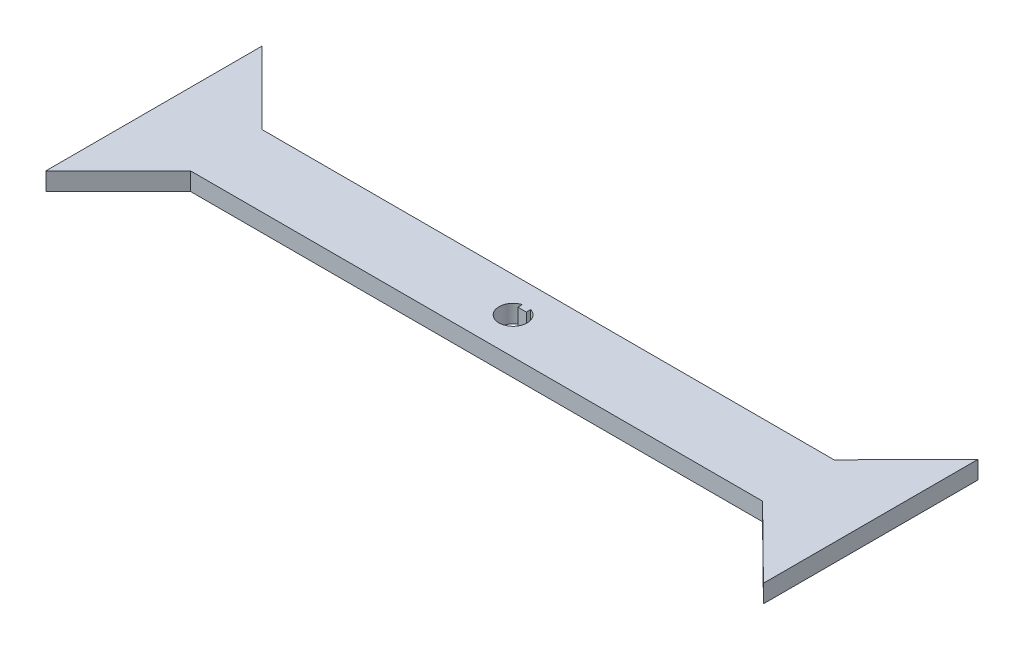
ISO-10303-21;
HEADER;
FILE_DESCRIPTION(('STEP AP214'),'2;1');
FILE_NAME('part.step','',(''),(''),'','','');
FILE_SCHEMA(('AUTOMOTIVE_DESIGN { 1 0 10303 214 1 1 1 1 }'));
ENDSEC;
DATA;
#1=APPLICATION_CONTEXT('core data for automotive mechanical design processes');
#2=APPLICATION_PROTOCOL_DEFINITION('international standard','automotive_design',2000,#1);
#3=PRODUCT_CONTEXT('',#1,'mechanical');
#4=PRODUCT('Part','Part','',(#3));
#5=PRODUCT_RELATED_PRODUCT_CATEGORY('part','',(#4));
#6=PRODUCT_DEFINITION_FORMATION('','',#4);
#7=PRODUCT_DEFINITION_CONTEXT('part definition',#1,'design');
#8=PRODUCT_DEFINITION('design','',#6,#7);
#9=PRODUCT_DEFINITION_SHAPE('','',#8);
#10=(LENGTH_UNIT() NAMED_UNIT(*) SI_UNIT(.MILLI.,.METRE.));
#11=(NAMED_UNIT(*) PLANE_ANGLE_UNIT() SI_UNIT($,.RADIAN.));
#12=(NAMED_UNIT(*) SI_UNIT($,.STERADIAN.) SOLID_ANGLE_UNIT());
#13=UNCERTAINTY_MEASURE_WITH_UNIT(LENGTH_MEASURE(1.E-05),#10,'distance_accuracy_value','');
#14=(GEOMETRIC_REPRESENTATION_CONTEXT(3) GLOBAL_UNCERTAINTY_ASSIGNED_CONTEXT((#13)) GLOBAL_UNIT_ASSIGNED_CONTEXT((#10,
#11,#12)) REPRESENTATION_CONTEXT('',''));
#15=CARTESIAN_POINT('',(0.,0.,0.));
#16=DIRECTION('',(0.,0.,1.));
#17=DIRECTION('',(1.,0.,0.));
#18=AXIS2_PLACEMENT_3D('',#15,#16,#17);
#19=CARTESIAN_POINT('',(0.,6.35,-25.4));
#20=DIRECTION('',(0.,0.,-1.));
#21=DIRECTION('',(-1.,0.,0.));
#22=AXIS2_PLACEMENT_3D('',#19,#20,#21);
#23=PLANE('',#22);
#24=DIRECTION('',(1.,0.,0.));
#25=VECTOR('',#24,1.);
#26=CARTESIAN_POINT('',(0.,0.,-25.4));
#27=LINE('',#26,#25);
#28=CARTESIAN_POINT('',(25.6292917522596,0.,-25.4));
#29=VERTEX_POINT('',#28);
#30=CARTESIAN_POINT('',(228.829291752258,0.,-25.4));
#31=VERTEX_POINT('',#30);
#32=EDGE_CURVE('E192',#29,#31,#27,.T.);
#33=ORIENTED_EDGE('',*,*,#32,.F.);
#34=DIRECTION('',(0.,-1.,0.));
#35=VECTOR('',#34,1.);
#36=CARTESIAN_POINT('',(25.6292917522596,6.35,-25.4));
#37=LINE('',#36,#35);
#38=CARTESIAN_POINT('',(25.6292917522596,6.35,-25.4));
#39=VERTEX_POINT('',#38);
#40=EDGE_CURVE('E11',#39,#29,#37,.T.);
#41=ORIENTED_EDGE('',*,*,#40,.F.);
#42=DIRECTION('',(1.,0.,0.));
#43=VECTOR('',#42,1.);
#44=CARTESIAN_POINT('',(0.,6.35,-25.4));
#45=LINE('',#44,#43);
#46=CARTESIAN_POINT('',(228.829291752258,6.35,-25.4));
#47=VERTEX_POINT('',#46);
#48=EDGE_CURVE('E266',#39,#47,#45,.T.);
#49=ORIENTED_EDGE('',*,*,#48,.T.);
#50=DIRECTION('',(0.,-1.,0.));
#51=VECTOR('',#50,1.);
#52=CARTESIAN_POINT('',(228.829291752258,6.35,-25.4));
#53=LINE('',#52,#51);
#54=EDGE_CURVE('E111',#47,#31,#53,.T.);
#55=ORIENTED_EDGE('',*,*,#54,.T.);
#56=EDGE_LOOP('',(#33,#41,#49,#55));
#57=FACE_BOUND('',#56,.T.);
#58=ADVANCED_FACE('F45',(#57),#23,.T.);
#59=CARTESIAN_POINT('',(25.5146458761298,6.35,-25.5146458761298));
#60=DIRECTION('',(0.707106781186548,0.,-0.707106781186548));
#61=DIRECTION('',(-0.707106781186548,0.,-0.707106781186548));
#62=AXIS2_PLACEMENT_3D('',#59,#60,#61);
#63=PLANE('',#62);
#64=DIRECTION('',(0.707106781186548,0.,0.707106781186548));
#65=VECTOR('',#64,1.);
#66=CARTESIAN_POINT('',(25.5146458761298,0.,-25.5146458761298));
#67=LINE('',#66,#65);
#68=CARTESIAN_POINT('',(0.,0.,-51.0292917522596));
#69=VERTEX_POINT('',#68);
#70=EDGE_CURVE('E196',#69,#29,#67,.T.);
#71=ORIENTED_EDGE('',*,*,#70,.F.);
#72=DIRECTION('',(0.,-1.,0.));
#73=VECTOR('',#72,1.);
#74=CARTESIAN_POINT('',(0.,6.35,-51.0292917522596));
#75=LINE('',#74,#73);
#76=CARTESIAN_POINT('',(0.,6.35,-51.0292917522596));
#77=VERTEX_POINT('',#76);
#78=EDGE_CURVE('E56',#77,#69,#75,.T.);
#79=ORIENTED_EDGE('',*,*,#78,.F.);
#80=DIRECTION('',(0.707106781186548,0.,0.707106781186548));
#81=VECTOR('',#80,1.);
#82=CARTESIAN_POINT('',(25.5146458761298,6.35,-25.5146458761298));
#83=LINE('',#82,#81);
#84=EDGE_CURVE('E269',#77,#39,#83,.T.);
#85=ORIENTED_EDGE('',*,*,#84,.T.);
#86=ORIENTED_EDGE('',*,*,#40,.T.);
#87=EDGE_LOOP('',(#71,#79,#85,#86));
#88=FACE_BOUND('',#87,.T.);
#89=ADVANCED_FACE('F295',(#88),#63,.T.);
#90=CARTESIAN_POINT('',(0.,6.35,0.));
#91=DIRECTION('',(-1.,0.,0.));
#92=DIRECTION('',(0.,0.,1.));
#93=AXIS2_PLACEMENT_3D('',#90,#91,#92);
#94=PLANE('',#93);
#95=DIRECTION('',(0.,0.,-1.));
#96=VECTOR('',#95,1.);
#97=CARTESIAN_POINT('',(0.,0.,0.));
#98=LINE('',#97,#96);
#99=CARTESIAN_POINT('',(0.,0.,25.6292917522597));
#100=VERTEX_POINT('',#99);
#101=EDGE_CURVE('E200',#100,#69,#98,.T.);
#102=ORIENTED_EDGE('',*,*,#101,.F.);
#103=DIRECTION('',(0.,-1.,0.));
#104=VECTOR('',#103,1.);
#105=CARTESIAN_POINT('',(0.,6.35,25.6292917522597));
#106=LINE('',#105,#104);
#107=CARTESIAN_POINT('',(0.,6.35,25.6292917522597));
#108=VERTEX_POINT('',#107);
#109=EDGE_CURVE('E230',#108,#100,#106,.T.);
#110=ORIENTED_EDGE('',*,*,#109,.F.);
#111=DIRECTION('',(0.,0.,-1.));
#112=VECTOR('',#111,1.);
#113=CARTESIAN_POINT('',(0.,6.35,0.));
#114=LINE('',#113,#112);
#115=EDGE_CURVE('E276',#108,#77,#114,.T.);
#116=ORIENTED_EDGE('',*,*,#115,.T.);
#117=ORIENTED_EDGE('',*,*,#78,.T.);
#118=EDGE_LOOP('',(#102,#110,#116,#117));
#119=FACE_BOUND('',#118,.T.);
#120=ADVANCED_FACE('F298',(#119),#94,.T.);
#121=CARTESIAN_POINT('',(12.8146458761298,6.35,12.8146458761298));
#122=DIRECTION('',(-0.707106781186548,0.,-0.707106781186547));
#123=DIRECTION('',(-0.707106781186547,0.,0.707106781186548));
#124=AXIS2_PLACEMENT_3D('',#121,#122,#123);
#125=PLANE('',#124);
#126=DIRECTION('',(0.707106781186547,0.,-0.707106781186548));
#127=VECTOR('',#126,1.);
#128=CARTESIAN_POINT('',(12.8146458761298,0.,12.8146458761298));
#129=LINE('',#128,#127);
#130=CARTESIAN_POINT('',(25.6292917522596,0.,0.));
#131=VERTEX_POINT('',#130);
#132=EDGE_CURVE('E204',#100,#131,#129,.T.);
#133=ORIENTED_EDGE('',*,*,#132,.T.);
#134=DIRECTION('',(0.,-1.,0.));
#135=VECTOR('',#134,1.);
#136=CARTESIAN_POINT('',(25.6292917522596,6.35,0.));
#137=LINE('',#136,#135);
#138=CARTESIAN_POINT('',(25.6292917522596,6.35,0.));
#139=VERTEX_POINT('',#138);
#140=EDGE_CURVE('E226',#139,#131,#137,.T.);
#141=ORIENTED_EDGE('',*,*,#140,.F.);
#142=DIRECTION('',(0.707106781186547,0.,-0.707106781186548));
#143=VECTOR('',#142,1.);
#144=CARTESIAN_POINT('',(12.8146458761298,6.35,12.8146458761298));
#145=LINE('',#144,#143);
#146=EDGE_CURVE('E280',#108,#139,#145,.T.);
#147=ORIENTED_EDGE('',*,*,#146,.F.);
#148=ORIENTED_EDGE('',*,*,#109,.T.);
#149=EDGE_LOOP('',(#133,#141,#147,#148));
#150=FACE_BOUND('',#149,.T.);
#151=ADVANCED_FACE('F288',(#150),#125,.F.);
#152=CARTESIAN_POINT('',(0.,6.35,0.));
#153=DIRECTION('',(0.,0.,-1.));
#154=DIRECTION('',(-1.,0.,0.));
#155=AXIS2_PLACEMENT_3D('',#152,#153,#154);
#156=PLANE('',#155);
#157=DIRECTION('',(1.,0.,0.));
#158=VECTOR('',#157,1.);
#159=CARTESIAN_POINT('',(0.,0.,0.));
#160=LINE('',#159,#158);
#161=CARTESIAN_POINT('',(228.829291752258,0.,0.));
#162=VERTEX_POINT('',#161);
#163=EDGE_CURVE('E208',#131,#162,#160,.T.);
#164=ORIENTED_EDGE('',*,*,#163,.T.);
#165=DIRECTION('',(0.,-1.,0.));
#166=VECTOR('',#165,1.);
#167=CARTESIAN_POINT('',(228.829291752258,6.35,0.));
#168=LINE('',#167,#166);
#169=CARTESIAN_POINT('',(228.829291752258,6.35,0.));
#170=VERTEX_POINT('',#169);
#171=EDGE_CURVE('E159',#170,#162,#168,.T.);
#172=ORIENTED_EDGE('',*,*,#171,.F.);
#173=DIRECTION('',(1.,0.,0.));
#174=VECTOR('',#173,1.);
#175=CARTESIAN_POINT('',(0.,6.35,0.));
#176=LINE('',#175,#174);
#177=EDGE_CURVE('E164',#139,#170,#176,.T.);
#178=ORIENTED_EDGE('',*,*,#177,.F.);
#179=ORIENTED_EDGE('',*,*,#140,.T.);
#180=EDGE_LOOP('',(#164,#172,#178,#179));
#181=FACE_BOUND('',#180,.T.);
#182=ADVANCED_FACE('F291',(#181),#156,.F.);
#183=CARTESIAN_POINT('',(113.031199415503,6.35,-114.406281588253));
#184=DIRECTION('',(-0.702818783375139,0.,0.711368932225107));
#185=DIRECTION('',(0.711368932225107,0.,0.702818783375139));
#186=AXIS2_PLACEMENT_3D('',#183,#184,#185);
#187=PLANE('',#186);
#188=DIRECTION('',(-0.711368932225107,0.,-0.702818783375139));
#189=VECTOR('',#188,1.);
#190=CARTESIAN_POINT('',(113.031199415503,0.,-114.406281588253));
#191=LINE('',#190,#189);
#192=CARTESIAN_POINT('',(254.229291752264,0.,25.0947100569799));
#193=VERTEX_POINT('',#192);
#194=EDGE_CURVE('E153',#193,#162,#191,.T.);
#195=ORIENTED_EDGE('',*,*,#194,.F.);
#196=DIRECTION('',(0.,-1.,0.));
#197=VECTOR('',#196,1.);
#198=CARTESIAN_POINT('',(254.229291752264,6.35,25.0947100569799));
#199=LINE('',#198,#197);
#200=CARTESIAN_POINT('',(254.229291752264,6.35,25.0947100569799));
#201=VERTEX_POINT('',#200);
#202=EDGE_CURVE('E148',#201,#193,#199,.T.);
#203=ORIENTED_EDGE('',*,*,#202,.F.);
#204=DIRECTION('',(-0.711368932225107,0.,-0.702818783375139));
#205=VECTOR('',#204,1.);
#206=CARTESIAN_POINT('',(113.031199415503,6.35,-114.406281588253));
#207=LINE('',#206,#205);
#208=EDGE_CURVE('E151',#201,#170,#207,.T.);
#209=ORIENTED_EDGE('',*,*,#208,.T.);
#210=ORIENTED_EDGE('',*,*,#171,.T.);
#211=EDGE_LOOP('',(#195,#203,#209,#210));
#212=FACE_BOUND('',#211,.T.);
#213=ADVANCED_FACE('F150',(#212),#187,.T.);
#214=CARTESIAN_POINT('',(254.229291752264,6.35,-5.5561262448329E-13));
#215=DIRECTION('',(1.,0.,0.));
#216=DIRECTION('',(0.,0.,-1.));
#217=AXIS2_PLACEMENT_3D('',#214,#215,#216);
#218=PLANE('',#217);
#219=DIRECTION('',(0.,0.,1.));
#220=VECTOR('',#219,1.);
#221=CARTESIAN_POINT('',(254.229291752264,0.,-5.5561262448329E-13));
#222=LINE('',#221,#220);
#223=CARTESIAN_POINT('',(254.229291752264,0.,-51.1052899430199));
#224=VERTEX_POINT('',#223);
#225=EDGE_CURVE('E214',#224,#193,#222,.T.);
#226=ORIENTED_EDGE('',*,*,#225,.F.);
#227=DIRECTION('',(0.,-1.,0.));
#228=VECTOR('',#227,1.);
#229=CARTESIAN_POINT('',(254.229291752264,6.35,-51.1052899430199));
#230=LINE('',#229,#228);
#231=CARTESIAN_POINT('',(254.229291752264,6.35,-51.1052899430199));
#232=VERTEX_POINT('',#231);
#233=EDGE_CURVE('E104',#232,#224,#230,.T.);
#234=ORIENTED_EDGE('',*,*,#233,.F.);
#235=DIRECTION('',(0.,0.,1.));
#236=VECTOR('',#235,1.);
#237=CARTESIAN_POINT('',(254.229291752264,6.35,-5.5561262448329E-13));
#238=LINE('',#237,#236);
#239=EDGE_CURVE('E162',#232,#201,#238,.T.);
#240=ORIENTED_EDGE('',*,*,#239,.T.);
#241=ORIENTED_EDGE('',*,*,#202,.T.);
#242=EDGE_LOOP('',(#226,#234,#240,#241));
#243=FACE_BOUND('',#242,.T.);
#244=ADVANCED_FACE('F168',(#243),#218,.T.);
#245=CARTESIAN_POINT('',(128.729291752259,6.35,0.));
#246=DIRECTION('',(-1.,0.,0.));
#247=DIRECTION('',(0.,0.,1.));
#248=AXIS2_PLACEMENT_3D('',#245,#246,#247);
#249=PLANE('',#248);
#250=DIRECTION('',(0.,0.,-1.));
#251=VECTOR('',#250,1.);
#252=CARTESIAN_POINT('',(128.729291752259,0.,0.));
#253=LINE('',#252,#251);
#254=CARTESIAN_POINT('',(128.729291752259,0.,-16.2052899430257));
#255=VERTEX_POINT('',#254);
#256=CARTESIAN_POINT('',(128.729291752259,0.,-17.7749859501104));
#257=VERTEX_POINT('',#256);
#258=EDGE_CURVE('E176',#255,#257,#253,.T.);
#259=ORIENTED_EDGE('',*,*,#258,.T.);
#260=DIRECTION('',(0.,-1.,0.));
#261=VECTOR('',#260,1.);
#262=CARTESIAN_POINT('',(128.729291752259,6.35,-17.7749859501104));
#263=LINE('',#262,#261);
#264=CARTESIAN_POINT('',(128.729291752259,6.35,-17.7749859501104));
#265=VERTEX_POINT('',#264);
#266=EDGE_CURVE('E49',#265,#257,#263,.T.);
#267=ORIENTED_EDGE('',*,*,#266,.F.);
#268=DIRECTION('',(0.,0.,-1.));
#269=VECTOR('',#268,1.);
#270=CARTESIAN_POINT('',(128.729291752259,6.35,0.));
#271=LINE('',#270,#269);
#272=CARTESIAN_POINT('',(128.729291752259,6.35,-16.2052899430257));
#273=VERTEX_POINT('',#272);
#274=EDGE_CURVE('E119',#273,#265,#271,.T.);
#275=ORIENTED_EDGE('',*,*,#274,.F.);
#276=DIRECTION('',(0.,-1.,0.));
#277=VECTOR('',#276,1.);
#278=CARTESIAN_POINT('',(128.729291752259,6.35,-16.2052899430257));
#279=LINE('',#278,#277);
#280=EDGE_CURVE('E172',#273,#255,#279,.T.);
#281=ORIENTED_EDGE('',*,*,#280,.T.);
#282=EDGE_LOOP('',(#259,#267,#275,#281));
#283=FACE_BOUND('',#282,.T.);
#284=ADVANCED_FACE('F47',(#283),#249,.F.);
#285=CARTESIAN_POINT('',(127.229291752259,6.35,-13.0052899430257));
#286=DIRECTION('',(0.,-1.,0.));
#287=DIRECTION('',(0.,0.,-1.));
#288=AXIS2_PLACEMENT_3D('',#285,#286,#287);
#289=CYLINDRICAL_SURFACE('',#288,5.00000000000002);
#290=CARTESIAN_POINT('',(127.229291752259,0.,-13.0052899430257));
#291=DIRECTION('',(0.,1.,0.));
#292=DIRECTION('',(0.,0.,1.));
#293=AXIS2_PLACEMENT_3D('',#290,#291,#292);
#294=CIRCLE('',#293,5.00000000000002);
#295=CARTESIAN_POINT('',(125.729291752259,0.,-17.7749859501104));
#296=VERTEX_POINT('',#295);
#297=EDGE_CURVE('E180',#296,#257,#294,.T.);
#298=ORIENTED_EDGE('',*,*,#297,.F.);
#299=DIRECTION('',(0.,-1.,0.));
#300=VECTOR('',#299,1.);
#301=CARTESIAN_POINT('',(125.729291752259,6.35,-17.7749859501104));
#302=LINE('',#301,#300);
#303=CARTESIAN_POINT('',(125.729291752259,6.35,-17.7749859501104));
#304=VERTEX_POINT('',#303);
#305=EDGE_CURVE('E239',#304,#296,#302,.T.);
#306=ORIENTED_EDGE('',*,*,#305,.F.);
#307=CARTESIAN_POINT('',(127.229291752259,6.35,-13.0052899430257));
#308=DIRECTION('',(0.,1.,0.));
#309=DIRECTION('',(0.,0.,1.));
#310=AXIS2_PLACEMENT_3D('',#307,#308,#309);
#311=CIRCLE('',#310,5.00000000000002);
#312=EDGE_CURVE('E249',#304,#265,#311,.T.);
#313=ORIENTED_EDGE('',*,*,#312,.T.);
#314=ORIENTED_EDGE('',*,*,#266,.T.);
#315=EDGE_LOOP('',(#298,#306,#313,#314));
#316=FACE_BOUND('',#315,.T.);
#317=ADVANCED_FACE('F248',(#316),#289,.F.);
#318=CARTESIAN_POINT('',(125.729291752259,6.35,0.));
#319=DIRECTION('',(-1.,0.,0.));
#320=DIRECTION('',(0.,0.,1.));
#321=AXIS2_PLACEMENT_3D('',#318,#319,#320);
#322=PLANE('',#321);
#323=DIRECTION('',(0.,0.,-1.));
#324=VECTOR('',#323,1.);
#325=CARTESIAN_POINT('',(125.729291752259,0.,0.));
#326=LINE('',#325,#324);
#327=CARTESIAN_POINT('',(125.729291752259,0.,-16.2052899430257));
#328=VERTEX_POINT('',#327);
#329=EDGE_CURVE('E184',#328,#296,#326,.T.);
#330=ORIENTED_EDGE('',*,*,#329,.F.);
#331=DIRECTION('',(0.,-1.,0.));
#332=VECTOR('',#331,1.);
#333=CARTESIAN_POINT('',(125.729291752259,6.35,-16.2052899430257));
#334=LINE('',#333,#332);
#335=CARTESIAN_POINT('',(125.729291752259,6.35,-16.2052899430257));
#336=VERTEX_POINT('',#335);
#337=EDGE_CURVE('E237',#336,#328,#334,.T.);
#338=ORIENTED_EDGE('',*,*,#337,.F.);
#339=DIRECTION('',(0.,0.,-1.));
#340=VECTOR('',#339,1.);
#341=CARTESIAN_POINT('',(125.729291752259,6.35,0.));
#342=LINE('',#341,#340);
#343=EDGE_CURVE('E258',#336,#304,#342,.T.);
#344=ORIENTED_EDGE('',*,*,#343,.T.);
#345=ORIENTED_EDGE('',*,*,#305,.T.);
#346=EDGE_LOOP('',(#330,#338,#344,#345));
#347=FACE_BOUND('',#346,.T.);
#348=ADVANCED_FACE('F256',(#347),#322,.T.);
#349=CARTESIAN_POINT('',(0.,6.35,-16.2052899430257));
#350=DIRECTION('',(0.,0.,1.));
#351=DIRECTION('',(1.,0.,0.));
#352=AXIS2_PLACEMENT_3D('',#349,#350,#351);
#353=PLANE('',#352);
#354=DIRECTION('',(-1.,0.,0.));
#355=VECTOR('',#354,1.);
#356=CARTESIAN_POINT('',(0.,0.,-16.2052899430257));
#357=LINE('',#356,#355);
#358=EDGE_CURVE('E188',#255,#328,#357,.T.);
#359=ORIENTED_EDGE('',*,*,#358,.F.);
#360=ORIENTED_EDGE('',*,*,#280,.F.);
#361=DIRECTION('',(-1.,0.,0.));
#362=VECTOR('',#361,1.);
#363=CARTESIAN_POINT('',(0.,6.35,-16.2052899430257));
#364=LINE('',#363,#362);
#365=EDGE_CURVE('E261',#273,#336,#364,.T.);
#366=ORIENTED_EDGE('',*,*,#365,.T.);
#367=ORIENTED_EDGE('',*,*,#337,.T.);
#368=EDGE_LOOP('',(#359,#360,#366,#367));
#369=FACE_BOUND('',#368,.T.);
#370=ADVANCED_FACE('F264',(#369),#353,.T.);
#371=CARTESIAN_POINT('',(103.082471194669,6.35,101.858207946654));
#372=DIRECTION('',(0.711318164605316,0.,0.702870164897134));
#373=DIRECTION('',(0.702870164897134,0.,-0.711318164605316));
#374=AXIS2_PLACEMENT_3D('',#371,#372,#373);
#375=PLANE('',#374);
#376=DIRECTION('',(-0.702870164897134,0.,0.711318164605316));
#377=VECTOR('',#376,1.);
#378=CARTESIAN_POINT('',(103.082471194669,0.,101.858207946654));
#379=LINE('',#378,#377);
#380=EDGE_CURVE('E217',#224,#31,#379,.T.);
#381=ORIENTED_EDGE('',*,*,#380,.T.);
#382=ORIENTED_EDGE('',*,*,#54,.F.);
#383=DIRECTION('',(-0.702870164897134,0.,0.711318164605316));
#384=VECTOR('',#383,1.);
#385=CARTESIAN_POINT('',(103.082471194669,6.35,101.858207946654));
#386=LINE('',#385,#384);
#387=EDGE_CURVE('E65',#232,#47,#386,.T.);
#388=ORIENTED_EDGE('',*,*,#387,.F.);
#389=ORIENTED_EDGE('',*,*,#233,.T.);
#390=EDGE_LOOP('',(#381,#382,#388,#389));
#391=FACE_BOUND('',#390,.T.);
#392=ADVANCED_FACE('F292',(#391),#375,.F.);
#393=CARTESIAN_POINT('',(0.,6.35,0.));
#394=DIRECTION('',(0.,1.,0.));
#395=DIRECTION('',(0.,0.,1.));
#396=AXIS2_PLACEMENT_3D('',#393,#394,#395);
#397=PLANE('',#396);
#398=ORIENTED_EDGE('',*,*,#274,.T.);
#399=ORIENTED_EDGE('',*,*,#312,.F.);
#400=ORIENTED_EDGE('',*,*,#343,.F.);
#401=ORIENTED_EDGE('',*,*,#365,.F.);
#402=EDGE_LOOP('',(#398,#399,#400,#401));
#403=FACE_BOUND('',#402,.T.);
#404=ORIENTED_EDGE('',*,*,#48,.F.);
#405=ORIENTED_EDGE('',*,*,#84,.F.);
#406=ORIENTED_EDGE('',*,*,#115,.F.);
#407=ORIENTED_EDGE('',*,*,#146,.T.);
#408=ORIENTED_EDGE('',*,*,#177,.T.);
#409=ORIENTED_EDGE('',*,*,#208,.F.);
#410=ORIENTED_EDGE('',*,*,#239,.F.);
#411=ORIENTED_EDGE('',*,*,#387,.T.);
#412=EDGE_LOOP('',(#404,#405,#406,#407,#408,#409,#410,#411));
#413=FACE_BOUND('',#412,.T.);
#414=ADVANCED_FACE('F161',(#403,#413),#397,.T.);
#415=CARTESIAN_POINT('',(0.,0.,0.));
#416=DIRECTION('',(0.,1.,0.));
#417=DIRECTION('',(0.,0.,1.));
#418=AXIS2_PLACEMENT_3D('',#415,#416,#417);
#419=PLANE('',#418);
#420=ORIENTED_EDGE('',*,*,#258,.F.);
#421=ORIENTED_EDGE('',*,*,#358,.T.);
#422=ORIENTED_EDGE('',*,*,#329,.T.);
#423=ORIENTED_EDGE('',*,*,#297,.T.);
#424=EDGE_LOOP('',(#420,#421,#422,#423));
#425=FACE_BOUND('',#424,.T.);
#426=ORIENTED_EDGE('',*,*,#32,.T.);
#427=ORIENTED_EDGE('',*,*,#380,.F.);
#428=ORIENTED_EDGE('',*,*,#225,.T.);
#429=ORIENTED_EDGE('',*,*,#194,.T.);
#430=ORIENTED_EDGE('',*,*,#163,.F.);
#431=ORIENTED_EDGE('',*,*,#132,.F.);
#432=ORIENTED_EDGE('',*,*,#101,.T.);
#433=ORIENTED_EDGE('',*,*,#70,.T.);
#434=EDGE_LOOP('',(#426,#427,#428,#429,#430,#431,#432,#433));
#435=FACE_BOUND('',#434,.T.);
#436=ADVANCED_FACE('F254',(#425,#435),#419,.F.);
#437=CLOSED_SHELL('',(#58,#89,#120,#151,#182,#213,#244,#284,#317,#348,#370,#392,#414,#436));
#438=MANIFOLD_SOLID_BREP('B2',#437);
#439=ADVANCED_BREP_SHAPE_REPRESENTATION('',(#18,#438),#14);
#440=SHAPE_DEFINITION_REPRESENTATION(#9,#439);
ENDSEC;
END-ISO-10303-21;
